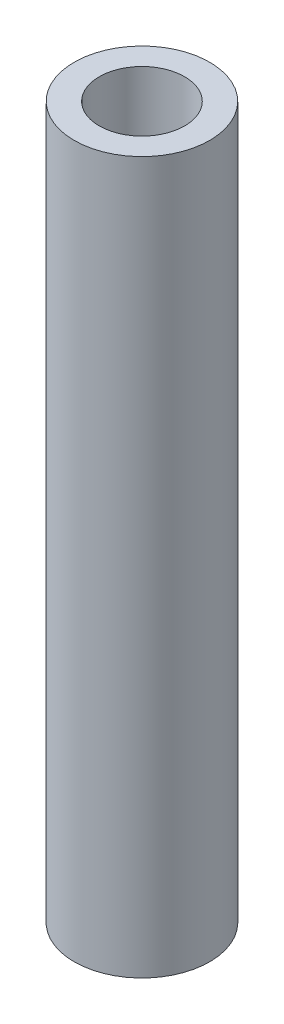
ISO-10303-21;
HEADER;
FILE_DESCRIPTION(('STEP AP214'),'2;1');
FILE_NAME('part.step','',(''),(''),'','','');
FILE_SCHEMA(('AUTOMOTIVE_DESIGN { 1 0 10303 214 1 1 1 1 }'));
ENDSEC;
DATA;
#1=APPLICATION_CONTEXT('core data for automotive mechanical design processes');
#2=APPLICATION_PROTOCOL_DEFINITION('international standard','automotive_design',2000,#1);
#3=PRODUCT_CONTEXT('',#1,'mechanical');
#4=PRODUCT('Part','Part','',(#3));
#5=PRODUCT_RELATED_PRODUCT_CATEGORY('part','',(#4));
#6=PRODUCT_DEFINITION_FORMATION('','',#4);
#7=PRODUCT_DEFINITION_CONTEXT('part definition',#1,'design');
#8=PRODUCT_DEFINITION('design','',#6,#7);
#9=PRODUCT_DEFINITION_SHAPE('','',#8);
#10=(LENGTH_UNIT() NAMED_UNIT(*) SI_UNIT(.MILLI.,.METRE.));
#11=(NAMED_UNIT(*) PLANE_ANGLE_UNIT() SI_UNIT($,.RADIAN.));
#12=(NAMED_UNIT(*) SI_UNIT($,.STERADIAN.) SOLID_ANGLE_UNIT());
#13=UNCERTAINTY_MEASURE_WITH_UNIT(LENGTH_MEASURE(1.E-05),#10,'distance_accuracy_value','');
#14=(GEOMETRIC_REPRESENTATION_CONTEXT(3) GLOBAL_UNCERTAINTY_ASSIGNED_CONTEXT((#13)) GLOBAL_UNIT_ASSIGNED_CONTEXT((#10,
#11,#12)) REPRESENTATION_CONTEXT('',''));
#15=CARTESIAN_POINT('',(0.,0.,0.));
#16=DIRECTION('',(0.,0.,1.));
#17=DIRECTION('',(1.,0.,0.));
#18=AXIS2_PLACEMENT_3D('',#15,#16,#17);
#19=CARTESIAN_POINT('',(0.,-33.3375,0.));
#20=DIRECTION('',(0.,1.,0.));
#21=DIRECTION('',(0.,0.,1.));
#22=AXIS2_PLACEMENT_3D('',#19,#20,#21);
#23=CYLINDRICAL_SURFACE('',#22,3.175);
#24=CARTESIAN_POINT('',(0.,-33.3375,0.));
#25=DIRECTION('',(0.,1.,0.));
#26=DIRECTION('',(0.,0.,1.));
#27=AXIS2_PLACEMENT_3D('',#24,#25,#26);
#28=CIRCLE('',#27,3.175);
#29=CARTESIAN_POINT('',(0.,-33.3375,3.175));
#30=VERTEX_POINT('',#29);
#31=EDGE_CURVE('E10',#30,#30,#28,.T.);
#32=ORIENTED_EDGE('',*,*,#31,.T.);
#33=EDGE_LOOP('',(#32));
#34=FACE_BOUND('',#33,.T.);
#35=CARTESIAN_POINT('',(0.,0.,0.));
#36=DIRECTION('',(0.,1.,0.));
#37=DIRECTION('',(0.,0.,1.));
#38=AXIS2_PLACEMENT_3D('',#35,#36,#37);
#39=CIRCLE('',#38,3.175);
#40=CARTESIAN_POINT('',(0.,0.,3.175));
#41=VERTEX_POINT('',#40);
#42=EDGE_CURVE('E37',#41,#41,#39,.T.);
#43=ORIENTED_EDGE('',*,*,#42,.F.);
#44=EDGE_LOOP('',(#43));
#45=FACE_BOUND('',#44,.T.);
#46=ADVANCED_FACE('F34',(#34,#45),#23,.T.);
#47=CARTESIAN_POINT('',(0.,-33.3375,0.));
#48=DIRECTION('',(0.,1.,0.));
#49=DIRECTION('',(0.,0.,1.));
#50=AXIS2_PLACEMENT_3D('',#47,#48,#49);
#51=PLANE('',#50);
#52=CARTESIAN_POINT('',(0.,-33.3375,0.));
#53=DIRECTION('',(0.,1.,0.));
#54=DIRECTION('',(0.,0.,1.));
#55=AXIS2_PLACEMENT_3D('',#52,#53,#54);
#56=CIRCLE('',#55,2.);
#57=CARTESIAN_POINT('',(0.,-33.3375,2.));
#58=VERTEX_POINT('',#57);
#59=EDGE_CURVE('E44',#58,#58,#56,.T.);
#60=ORIENTED_EDGE('',*,*,#59,.T.);
#61=EDGE_LOOP('',(#60));
#62=FACE_BOUND('',#61,.T.);
#63=ORIENTED_EDGE('',*,*,#31,.F.);
#64=EDGE_LOOP('',(#63));
#65=FACE_BOUND('',#64,.T.);
#66=ADVANCED_FACE('F52',(#62,#65),#51,.F.);
#67=CARTESIAN_POINT('',(0.,0.,0.));
#68=DIRECTION('',(0.,1.,0.));
#69=DIRECTION('',(0.,0.,1.));
#70=AXIS2_PLACEMENT_3D('',#67,#68,#69);
#71=PLANE('',#70);
#72=CARTESIAN_POINT('',(0.,0.,0.));
#73=DIRECTION('',(0.,1.,0.));
#74=DIRECTION('',(0.,0.,1.));
#75=AXIS2_PLACEMENT_3D('',#72,#73,#74);
#76=CIRCLE('',#75,2.);
#77=CARTESIAN_POINT('',(0.,0.,2.));
#78=VERTEX_POINT('',#77);
#79=EDGE_CURVE('E46',#78,#78,#76,.T.);
#80=ORIENTED_EDGE('',*,*,#79,.F.);
#81=EDGE_LOOP('',(#80));
#82=FACE_BOUND('',#81,.T.);
#83=ORIENTED_EDGE('',*,*,#42,.T.);
#84=EDGE_LOOP('',(#83));
#85=FACE_BOUND('',#84,.T.);
#86=ADVANCED_FACE('F58',(#82,#85),#71,.T.);
#87=CARTESIAN_POINT('',(0.,-33.3375,0.));
#88=DIRECTION('',(0.,1.,0.));
#89=DIRECTION('',(0.,0.,1.));
#90=AXIS2_PLACEMENT_3D('',#87,#88,#89);
#91=CYLINDRICAL_SURFACE('',#90,2.);
#92=ORIENTED_EDGE('',*,*,#59,.F.);
#93=EDGE_LOOP('',(#92));
#94=FACE_BOUND('',#93,.T.);
#95=ORIENTED_EDGE('',*,*,#79,.T.);
#96=EDGE_LOOP('',(#95));
#97=FACE_BOUND('',#96,.T.);
#98=ADVANCED_FACE('F55',(#94,#97),#91,.F.);
#99=CLOSED_SHELL('',(#46,#66,#86,#98));
#100=MANIFOLD_SOLID_BREP('B2',#99);
#101=ADVANCED_BREP_SHAPE_REPRESENTATION('',(#18,#100),#14);
#102=SHAPE_DEFINITION_REPRESENTATION(#9,#101);
ENDSEC;
END-ISO-10303-21;
